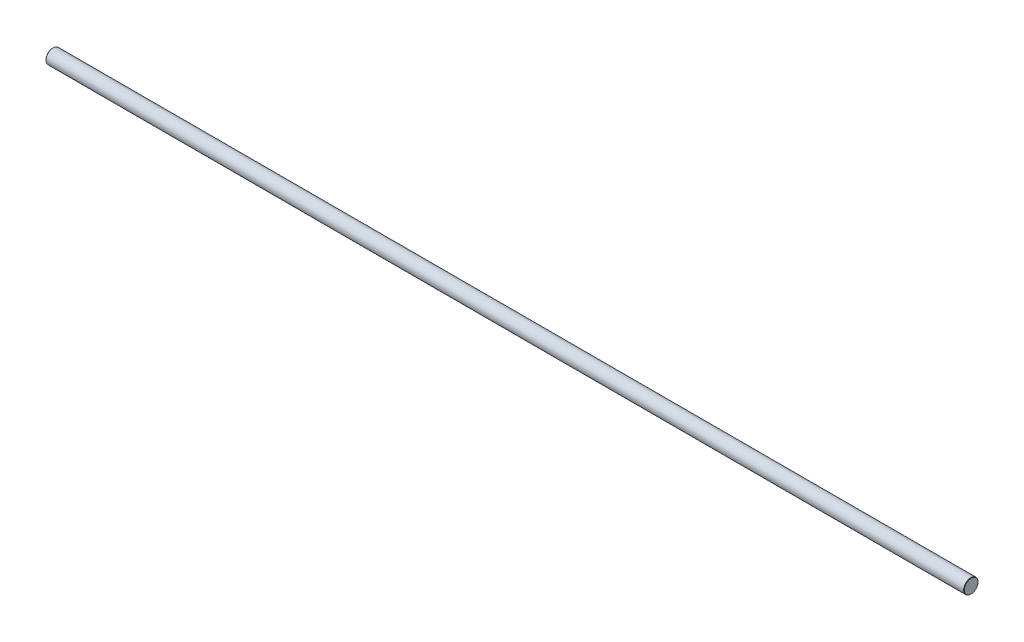
ISO-10303-21;
HEADER;
FILE_DESCRIPTION(('STEP AP214'),'2;1');
FILE_NAME('part.step','',(''),(''),'','','');
FILE_SCHEMA(('AUTOMOTIVE_DESIGN { 1 0 10303 214 1 1 1 1 }'));
ENDSEC;
DATA;
#1=APPLICATION_CONTEXT('core data for automotive mechanical design processes');
#2=APPLICATION_PROTOCOL_DEFINITION('international standard','automotive_design',2000,#1);
#3=PRODUCT_CONTEXT('',#1,'mechanical');
#4=PRODUCT('Part','Part','',(#3));
#5=PRODUCT_RELATED_PRODUCT_CATEGORY('part','',(#4));
#6=PRODUCT_DEFINITION_FORMATION('','',#4);
#7=PRODUCT_DEFINITION_CONTEXT('part definition',#1,'design');
#8=PRODUCT_DEFINITION('design','',#6,#7);
#9=PRODUCT_DEFINITION_SHAPE('','',#8);
#10=(LENGTH_UNIT() NAMED_UNIT(*) SI_UNIT(.MILLI.,.METRE.));
#11=(NAMED_UNIT(*) PLANE_ANGLE_UNIT() SI_UNIT($,.RADIAN.));
#12=(NAMED_UNIT(*) SI_UNIT($,.STERADIAN.) SOLID_ANGLE_UNIT());
#13=UNCERTAINTY_MEASURE_WITH_UNIT(LENGTH_MEASURE(1.E-05),#10,'distance_accuracy_value','');
#14=(GEOMETRIC_REPRESENTATION_CONTEXT(3) GLOBAL_UNCERTAINTY_ASSIGNED_CONTEXT((#13)) GLOBAL_UNIT_ASSIGNED_CONTEXT((#10,
#11,#12)) REPRESENTATION_CONTEXT('',''));
#15=CARTESIAN_POINT('',(0.,0.,0.));
#16=DIRECTION('',(0.,0.,1.));
#17=DIRECTION('',(1.,0.,0.));
#18=AXIS2_PLACEMENT_3D('',#15,#16,#17);
#19=CARTESIAN_POINT('',(304.8,0.,0.));
#20=DIRECTION('',(-1.,0.,0.));
#21=DIRECTION('',(0.,0.,1.));
#22=AXIS2_PLACEMENT_3D('',#19,#20,#21);
#23=CYLINDRICAL_SURFACE('',#22,4.7625);
#24=CARTESIAN_POINT('',(-304.55235,0.,0.));
#25=DIRECTION('',(1.,0.,0.));
#26=DIRECTION('',(0.,0.,-1.));
#27=AXIS2_PLACEMENT_3D('',#24,#25,#26);
#28=CIRCLE('',#27,4.7625);
#29=CARTESIAN_POINT('',(-304.55235,0.,4.7625));
#30=VERTEX_POINT('',#29);
#31=EDGE_CURVE('E49',#30,#30,#28,.T.);
#32=CARTESIAN_POINT('',(304.55235,0.,0.));
#33=DIRECTION('',(1.,0.,0.));
#34=DIRECTION('',(0.,0.,-1.));
#35=AXIS2_PLACEMENT_3D('',#32,#33,#34);
#36=CIRCLE('',#35,4.7625);
#37=CARTESIAN_POINT('',(304.55235,0.,4.7625));
#38=VERTEX_POINT('',#37);
#39=EDGE_CURVE('E53',#38,#38,#36,.F.);
#40=CARTESIAN_POINT('',(-304.55235,0.,4.7625));
#41=CARTESIAN_POINT('',(-298.207509375,0.,4.7625));
#42=CARTESIAN_POINT('',(-291.86266875,0.,4.7625));
#43=CARTESIAN_POINT('',(-279.1729875,0.,4.7625));
#44=CARTESIAN_POINT('',(-272.828146875,0.,4.7625));
#45=CARTESIAN_POINT('',(-260.138465625,0.,4.7625));
#46=CARTESIAN_POINT('',(-253.793625,0.,4.7625));
#47=CARTESIAN_POINT('',(-241.10394375,0.,4.7625));
#48=CARTESIAN_POINT('',(-234.759103125,0.,4.7625));
#49=CARTESIAN_POINT('',(-222.069421875,0.,4.7625));
#50=CARTESIAN_POINT('',(-215.72458125,0.,4.7625));
#51=CARTESIAN_POINT('',(-203.0349,0.,4.7625));
#52=CARTESIAN_POINT('',(-196.690059375,0.,4.7625));
#53=CARTESIAN_POINT('',(-184.000378125,0.,4.7625));
#54=CARTESIAN_POINT('',(-177.6555375,0.,4.7625));
#55=CARTESIAN_POINT('',(-164.96585625,0.,4.7625));
#56=CARTESIAN_POINT('',(-158.621015625,0.,4.7625));
#57=CARTESIAN_POINT('',(-145.931334375,0.,4.7625));
#58=CARTESIAN_POINT('',(-139.58649375,0.,4.7625));
#59=CARTESIAN_POINT('',(-126.8968125,0.,4.7625));
#60=CARTESIAN_POINT('',(-120.551971875,0.,4.7625));
#61=CARTESIAN_POINT('',(-107.862290625,0.,4.7625));
#62=CARTESIAN_POINT('',(-101.51745,0.,4.7625));
#63=CARTESIAN_POINT('',(-88.8277687499997,0.,4.7625));
#64=CARTESIAN_POINT('',(-82.4829281249997,0.,4.7625));
#65=CARTESIAN_POINT('',(-69.7932468749997,0.,4.7625));
#66=CARTESIAN_POINT('',(-63.4484062499997,0.,4.7625));
#67=CARTESIAN_POINT('',(-50.7587249999997,0.,4.7625));
#68=CARTESIAN_POINT('',(-44.4138843749997,0.,4.7625));
#69=CARTESIAN_POINT('',(-31.7242031249996,0.,4.7625));
#70=CARTESIAN_POINT('',(-25.3793624999996,0.,4.7625));
#71=CARTESIAN_POINT('',(-12.6896812499997,0.,4.7625));
#72=CARTESIAN_POINT('',(-6.34484062499966,0.,4.7625));
#73=CARTESIAN_POINT('',(6.34484062500033,0.,4.7625));
#74=CARTESIAN_POINT('',(12.6896812500003,0.,4.7625));
#75=CARTESIAN_POINT('',(25.3793625000003,0.,4.7625));
#76=CARTESIAN_POINT('',(31.7242031250003,0.,4.7625));
#77=CARTESIAN_POINT('',(44.4138843750003,0.,4.7625));
#78=CARTESIAN_POINT('',(50.7587250000003,0.,4.7625));
#79=CARTESIAN_POINT('',(63.4484062500003,0.,4.7625));
#80=CARTESIAN_POINT('',(69.7932468750003,0.,4.7625));
#81=CARTESIAN_POINT('',(82.4829281250003,0.,4.7625));
#82=CARTESIAN_POINT('',(88.8277687500003,0.,4.7625));
#83=CARTESIAN_POINT('',(101.51745,0.,4.7625));
#84=CARTESIAN_POINT('',(107.862290625,0.,4.7625));
#85=CARTESIAN_POINT('',(120.551971875,0.,4.7625));
#86=CARTESIAN_POINT('',(126.8968125,0.,4.7625));
#87=CARTESIAN_POINT('',(139.58649375,0.,4.7625));
#88=CARTESIAN_POINT('',(145.931334375,0.,4.7625));
#89=CARTESIAN_POINT('',(158.621015625,0.,4.7625));
#90=CARTESIAN_POINT('',(164.96585625,0.,4.7625));
#91=CARTESIAN_POINT('',(177.6555375,0.,4.7625));
#92=CARTESIAN_POINT('',(184.000378125,0.,4.7625));
#93=CARTESIAN_POINT('',(196.690059375,0.,4.7625));
#94=CARTESIAN_POINT('',(203.0349,0.,4.7625));
#95=CARTESIAN_POINT('',(215.72458125,0.,4.7625));
#96=CARTESIAN_POINT('',(222.069421875,0.,4.7625));
#97=CARTESIAN_POINT('',(234.759103125,0.,4.7625));
#98=CARTESIAN_POINT('',(241.10394375,0.,4.7625));
#99=CARTESIAN_POINT('',(253.793625,0.,4.7625));
#100=CARTESIAN_POINT('',(260.138465625,0.,4.7625));
#101=CARTESIAN_POINT('',(272.828146875,0.,4.7625));
#102=CARTESIAN_POINT('',(279.1729875,0.,4.7625));
#103=CARTESIAN_POINT('',(291.86266875,0.,4.7625));
#104=CARTESIAN_POINT('',(298.207509375,0.,4.7625));
#105=CARTESIAN_POINT('',(304.55235,0.,4.7625));
#106=B_SPLINE_CURVE_WITH_KNOTS('',3,(#40,#41,#42,#43,#44,#45,#46,#47,#48,#49,#50,#51,#52,#53,
#54,#55,#56,#57,#58,#59,#60,#61,#62,#63,#64,#65,#66,#67,#68,#69,#70,#71,#72,#73,#74,#75,#76,#77,
#78,#79,#80,#81,#82,#83,#84,#85,#86,#87,#88,#89,#90,#91,#92,#93,#94,#95,#96,#97,#98,#99,#100,
#101,#102,#103,#104,#105),.UNSPECIFIED.,.F.,.F.,(4,2,2,2,2,2,2,2,2,2,2,2,2,2,2,2,2,2,2,2,2,2,2,
2,2,2,2,2,2,2,2,2,4),(0.,19.034521875,38.06904375,57.103565625,76.1380875,95.1726093750001,
114.20713125,133.241653125,152.276175,171.310696875,190.34521875,209.379740625,228.4142625,
247.448784375,266.48330625,285.517828125,304.55235,323.586871875,342.62139375,361.655915625,
380.6904375,399.724959375,418.75948125,437.794003125,456.828525,475.863046875,494.89756875,
513.932090625,532.9666125,552.001134375,571.03565625,590.070178125,609.1047),.UNSPECIFIED.);
#107=EDGE_CURVE('BSEAM36',#30,#38,#106,.T.);
#108=ORIENTED_EDGE('',*,*,#31,.T.);
#109=ORIENTED_EDGE('',*,*,#39,.T.);
#110=ORIENTED_EDGE('',*,*,#107,.T.);
#111=ORIENTED_EDGE('',*,*,#107,.F.);
#112=EDGE_LOOP('',(#108,#110,#109,#111));
#113=FACE_BOUND('',#112,.T.);
#114=ADVANCED_FACE('F36',(#113),#23,.T.);
#115=CARTESIAN_POINT('',(304.8,0.,0.));
#116=DIRECTION('',(1.,0.,0.));
#117=DIRECTION('',(0.,0.,-1.));
#118=AXIS2_PLACEMENT_3D('',#115,#116,#117);
#119=PLANE('',#118);
#120=CARTESIAN_POINT('',(304.8,0.,0.));
#121=DIRECTION('',(1.,0.,0.));
#122=DIRECTION('',(0.,0.,-1.));
#123=AXIS2_PLACEMENT_3D('',#120,#121,#122);
#124=CIRCLE('',#123,4.51485000000035);
#125=CARTESIAN_POINT('',(304.8,0.,-4.51485000000035));
#126=VERTEX_POINT('',#125);
#127=EDGE_CURVE('E10',#126,#126,#124,.T.);
#128=ORIENTED_EDGE('',*,*,#127,.T.);
#129=EDGE_LOOP('',(#128));
#130=FACE_BOUND('',#129,.T.);
#131=ADVANCED_FACE('F69',(#130),#119,.T.);
#132=CARTESIAN_POINT('',(-304.8,0.,0.));
#133=DIRECTION('',(1.,0.,0.));
#134=DIRECTION('',(0.,0.,-1.));
#135=AXIS2_PLACEMENT_3D('',#132,#133,#134);
#136=PLANE('',#135);
#137=CARTESIAN_POINT('',(-304.8,0.,0.));
#138=DIRECTION('',(1.,0.,0.));
#139=DIRECTION('',(0.,0.,-1.));
#140=AXIS2_PLACEMENT_3D('',#137,#138,#139);
#141=CIRCLE('',#140,4.51484999999963);
#142=CARTESIAN_POINT('',(-304.8,0.,-4.51484999999963));
#143=VERTEX_POINT('',#142);
#144=EDGE_CURVE('E44',#143,#143,#141,.F.);
#145=ORIENTED_EDGE('',*,*,#144,.T.);
#146=EDGE_LOOP('',(#145));
#147=FACE_BOUND('',#146,.T.);
#148=ADVANCED_FACE('F66',(#147),#136,.F.);
#149=CARTESIAN_POINT('',(-304.55235,0.,0.));
#150=DIRECTION('',(1.,0.,0.));
#151=DIRECTION('',(0.,0.,-1.));
#152=AXIS2_PLACEMENT_3D('',#149,#150,#151);
#153=CONICAL_SURFACE('',#152,4.7625,0.785398163397443);
#154=ORIENTED_EDGE('',*,*,#144,.F.);
#155=EDGE_LOOP('',(#154));
#156=FACE_BOUND('',#155,.T.);
#157=ORIENTED_EDGE('',*,*,#31,.F.);
#158=EDGE_LOOP('',(#157));
#159=FACE_BOUND('',#158,.T.);
#160=ADVANCED_FACE('F62',(#156,#159),#153,.T.);
#161=CARTESIAN_POINT('',(304.8,0.,0.));
#162=DIRECTION('',(-1.,0.,0.));
#163=DIRECTION('',(0.,0.,1.));
#164=AXIS2_PLACEMENT_3D('',#161,#162,#163);
#165=CONICAL_SURFACE('',#164,4.51485000000035,0.785398163397443);
#166=ORIENTED_EDGE('',*,*,#39,.F.);
#167=EDGE_LOOP('',(#166));
#168=FACE_BOUND('',#167,.T.);
#169=ORIENTED_EDGE('',*,*,#127,.F.);
#170=EDGE_LOOP('',(#169));
#171=FACE_BOUND('',#170,.T.);
#172=ADVANCED_FACE('F38',(#168,#171),#165,.T.);
#173=CLOSED_SHELL('',(#114,#131,#148,#160,#172));
#174=MANIFOLD_SOLID_BREP('B2',#173);
#175=ADVANCED_BREP_SHAPE_REPRESENTATION('',(#18,#174),#14);
#176=SHAPE_DEFINITION_REPRESENTATION(#9,#175);
ENDSEC;
END-ISO-10303-21;
